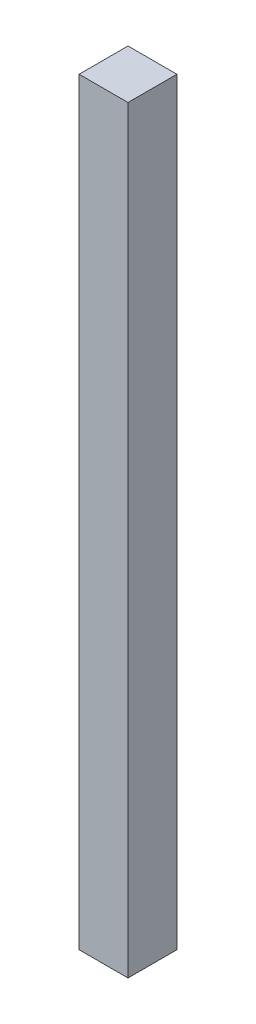
ISO-10303-21;
HEADER;
FILE_DESCRIPTION(('STEP AP214'),'2;1');
FILE_NAME('part.step','',(''),(''),'','','');
FILE_SCHEMA(('AUTOMOTIVE_DESIGN { 1 0 10303 214 1 1 1 1 }'));
ENDSEC;
DATA;
#1=APPLICATION_CONTEXT('core data for automotive mechanical design processes');
#2=APPLICATION_PROTOCOL_DEFINITION('international standard','automotive_design',2000,#1);
#3=PRODUCT_CONTEXT('',#1,'mechanical');
#4=PRODUCT('Part','Part','',(#3));
#5=PRODUCT_RELATED_PRODUCT_CATEGORY('part','',(#4));
#6=PRODUCT_DEFINITION_FORMATION('','',#4);
#7=PRODUCT_DEFINITION_CONTEXT('part definition',#1,'design');
#8=PRODUCT_DEFINITION('design','',#6,#7);
#9=PRODUCT_DEFINITION_SHAPE('','',#8);
#10=(LENGTH_UNIT() NAMED_UNIT(*) SI_UNIT(.MILLI.,.METRE.));
#11=(NAMED_UNIT(*) PLANE_ANGLE_UNIT() SI_UNIT($,.RADIAN.));
#12=(NAMED_UNIT(*) SI_UNIT($,.STERADIAN.) SOLID_ANGLE_UNIT());
#13=UNCERTAINTY_MEASURE_WITH_UNIT(LENGTH_MEASURE(1.E-05),#10,'distance_accuracy_value','');
#14=(GEOMETRIC_REPRESENTATION_CONTEXT(3) GLOBAL_UNCERTAINTY_ASSIGNED_CONTEXT((#13)) GLOBAL_UNIT_ASSIGNED_CONTEXT((#10,
#11,#12)) REPRESENTATION_CONTEXT('',''));
#15=CARTESIAN_POINT('',(0.,0.,0.));
#16=DIRECTION('',(0.,0.,1.));
#17=DIRECTION('',(1.,0.,0.));
#18=AXIS2_PLACEMENT_3D('',#15,#16,#17);
#19=CARTESIAN_POINT('',(0.,310.,0.));
#20=DIRECTION('',(-1.,0.,0.));
#21=DIRECTION('',(0.,0.,1.));
#22=AXIS2_PLACEMENT_3D('',#19,#20,#21);
#23=PLANE('',#22);
#24=DIRECTION('',(0.,0.,-1.));
#25=VECTOR('',#24,1.);
#26=CARTESIAN_POINT('',(0.,0.,0.));
#27=LINE('',#26,#25);
#28=CARTESIAN_POINT('',(0.,0.,0.));
#29=VERTEX_POINT('',#28);
#30=CARTESIAN_POINT('',(0.,0.,-20.));
#31=VERTEX_POINT('',#30);
#32=EDGE_CURVE('E104',#29,#31,#27,.T.);
#33=ORIENTED_EDGE('',*,*,#32,.F.);
#34=DIRECTION('',(0.,-1.,0.));
#35=VECTOR('',#34,1.);
#36=CARTESIAN_POINT('',(0.,310.,0.));
#37=LINE('',#36,#35);
#38=CARTESIAN_POINT('',(0.,310.,0.));
#39=VERTEX_POINT('',#38);
#40=EDGE_CURVE('E11',#39,#29,#37,.T.);
#41=ORIENTED_EDGE('',*,*,#40,.F.);
#42=DIRECTION('',(0.,0.,-1.));
#43=VECTOR('',#42,1.);
#44=CARTESIAN_POINT('',(0.,310.,0.));
#45=LINE('',#44,#43);
#46=CARTESIAN_POINT('',(0.,310.,-20.));
#47=VERTEX_POINT('',#46);
#48=EDGE_CURVE('E99',#39,#47,#45,.T.);
#49=ORIENTED_EDGE('',*,*,#48,.T.);
#50=DIRECTION('',(0.,-1.,0.));
#51=VECTOR('',#50,1.);
#52=CARTESIAN_POINT('',(0.,310.,-20.));
#53=LINE('',#52,#51);
#54=EDGE_CURVE('E42',#47,#31,#53,.T.);
#55=ORIENTED_EDGE('',*,*,#54,.T.);
#56=EDGE_LOOP('',(#33,#41,#49,#55));
#57=FACE_BOUND('',#56,.T.);
#58=ADVANCED_FACE('F39',(#57),#23,.T.);
#59=CARTESIAN_POINT('',(0.,310.,0.));
#60=DIRECTION('',(0.,0.,-1.));
#61=DIRECTION('',(-1.,0.,0.));
#62=AXIS2_PLACEMENT_3D('',#59,#60,#61);
#63=PLANE('',#62);
#64=DIRECTION('',(1.,0.,0.));
#65=VECTOR('',#64,1.);
#66=CARTESIAN_POINT('',(0.,0.,0.));
#67=LINE('',#66,#65);
#68=CARTESIAN_POINT('',(20.,0.,0.));
#69=VERTEX_POINT('',#68);
#70=EDGE_CURVE('E72',#29,#69,#67,.T.);
#71=ORIENTED_EDGE('',*,*,#70,.T.);
#72=DIRECTION('',(0.,-1.,0.));
#73=VECTOR('',#72,1.);
#74=CARTESIAN_POINT('',(20.,310.,0.));
#75=LINE('',#74,#73);
#76=CARTESIAN_POINT('',(20.,310.,0.));
#77=VERTEX_POINT('',#76);
#78=EDGE_CURVE('E48',#77,#69,#75,.T.);
#79=ORIENTED_EDGE('',*,*,#78,.F.);
#80=DIRECTION('',(1.,0.,0.));
#81=VECTOR('',#80,1.);
#82=CARTESIAN_POINT('',(0.,310.,0.));
#83=LINE('',#82,#81);
#84=EDGE_CURVE('E89',#39,#77,#83,.T.);
#85=ORIENTED_EDGE('',*,*,#84,.F.);
#86=ORIENTED_EDGE('',*,*,#40,.T.);
#87=EDGE_LOOP('',(#71,#79,#85,#86));
#88=FACE_BOUND('',#87,.T.);
#89=ADVANCED_FACE('F114',(#88),#63,.F.);
#90=CARTESIAN_POINT('',(20.,310.,0.));
#91=DIRECTION('',(-1.,0.,0.));
#92=DIRECTION('',(0.,0.,1.));
#93=AXIS2_PLACEMENT_3D('',#90,#91,#92);
#94=PLANE('',#93);
#95=DIRECTION('',(0.,0.,-1.));
#96=VECTOR('',#95,1.);
#97=CARTESIAN_POINT('',(20.,0.,0.));
#98=LINE('',#97,#96);
#99=CARTESIAN_POINT('',(20.,0.,-20.));
#100=VERTEX_POINT('',#99);
#101=EDGE_CURVE('E96',#69,#100,#98,.T.);
#102=ORIENTED_EDGE('',*,*,#101,.T.);
#103=DIRECTION('',(0.,-1.,0.));
#104=VECTOR('',#103,1.);
#105=CARTESIAN_POINT('',(20.,310.,-20.));
#106=LINE('',#105,#104);
#107=CARTESIAN_POINT('',(20.,310.,-20.));
#108=VERTEX_POINT('',#107);
#109=EDGE_CURVE('E93',#108,#100,#106,.T.);
#110=ORIENTED_EDGE('',*,*,#109,.F.);
#111=DIRECTION('',(0.,0.,-1.));
#112=VECTOR('',#111,1.);
#113=CARTESIAN_POINT('',(20.,310.,0.));
#114=LINE('',#113,#112);
#115=EDGE_CURVE('E84',#77,#108,#114,.T.);
#116=ORIENTED_EDGE('',*,*,#115,.F.);
#117=ORIENTED_EDGE('',*,*,#78,.T.);
#118=EDGE_LOOP('',(#102,#110,#116,#117));
#119=FACE_BOUND('',#118,.T.);
#120=ADVANCED_FACE('F94',(#119),#94,.F.);
#121=CARTESIAN_POINT('',(0.,310.,-20.));
#122=DIRECTION('',(0.,0.,-1.));
#123=DIRECTION('',(-1.,0.,0.));
#124=AXIS2_PLACEMENT_3D('',#121,#122,#123);
#125=PLANE('',#124);
#126=DIRECTION('',(1.,0.,0.));
#127=VECTOR('',#126,1.);
#128=CARTESIAN_POINT('',(0.,0.,-20.));
#129=LINE('',#128,#127);
#130=EDGE_CURVE('E107',#31,#100,#129,.T.);
#131=ORIENTED_EDGE('',*,*,#130,.F.);
#132=ORIENTED_EDGE('',*,*,#54,.F.);
#133=DIRECTION('',(1.,0.,0.));
#134=VECTOR('',#133,1.);
#135=CARTESIAN_POINT('',(0.,310.,-20.));
#136=LINE('',#135,#134);
#137=EDGE_CURVE('E88',#47,#108,#136,.T.);
#138=ORIENTED_EDGE('',*,*,#137,.T.);
#139=ORIENTED_EDGE('',*,*,#109,.T.);
#140=EDGE_LOOP('',(#131,#132,#138,#139));
#141=FACE_BOUND('',#140,.T.);
#142=ADVANCED_FACE('F98',(#141),#125,.T.);
#143=CARTESIAN_POINT('',(0.,310.,0.));
#144=DIRECTION('',(0.,-1.,0.));
#145=DIRECTION('',(0.,0.,-1.));
#146=AXIS2_PLACEMENT_3D('',#143,#144,#145);
#147=PLANE('',#146);
#148=ORIENTED_EDGE('',*,*,#48,.F.);
#149=ORIENTED_EDGE('',*,*,#84,.T.);
#150=ORIENTED_EDGE('',*,*,#115,.T.);
#151=ORIENTED_EDGE('',*,*,#137,.F.);
#152=EDGE_LOOP('',(#148,#149,#150,#151));
#153=FACE_BOUND('',#152,.T.);
#154=ADVANCED_FACE('F87',(#153),#147,.F.);
#155=CARTESIAN_POINT('',(0.,0.,0.));
#156=DIRECTION('',(0.,-1.,0.));
#157=DIRECTION('',(0.,0.,-1.));
#158=AXIS2_PLACEMENT_3D('',#155,#156,#157);
#159=PLANE('',#158);
#160=ORIENTED_EDGE('',*,*,#32,.T.);
#161=ORIENTED_EDGE('',*,*,#130,.T.);
#162=ORIENTED_EDGE('',*,*,#101,.F.);
#163=ORIENTED_EDGE('',*,*,#70,.F.);
#164=EDGE_LOOP('',(#160,#161,#162,#163));
#165=FACE_BOUND('',#164,.T.);
#166=ADVANCED_FACE('F112',(#165),#159,.T.);
#167=CLOSED_SHELL('',(#58,#89,#120,#142,#154,#166));
#168=MANIFOLD_SOLID_BREP('B2',#167);
#169=ADVANCED_BREP_SHAPE_REPRESENTATION('',(#18,#168),#14);
#170=SHAPE_DEFINITION_REPRESENTATION(#9,#169);
ENDSEC;
END-ISO-10303-21;
